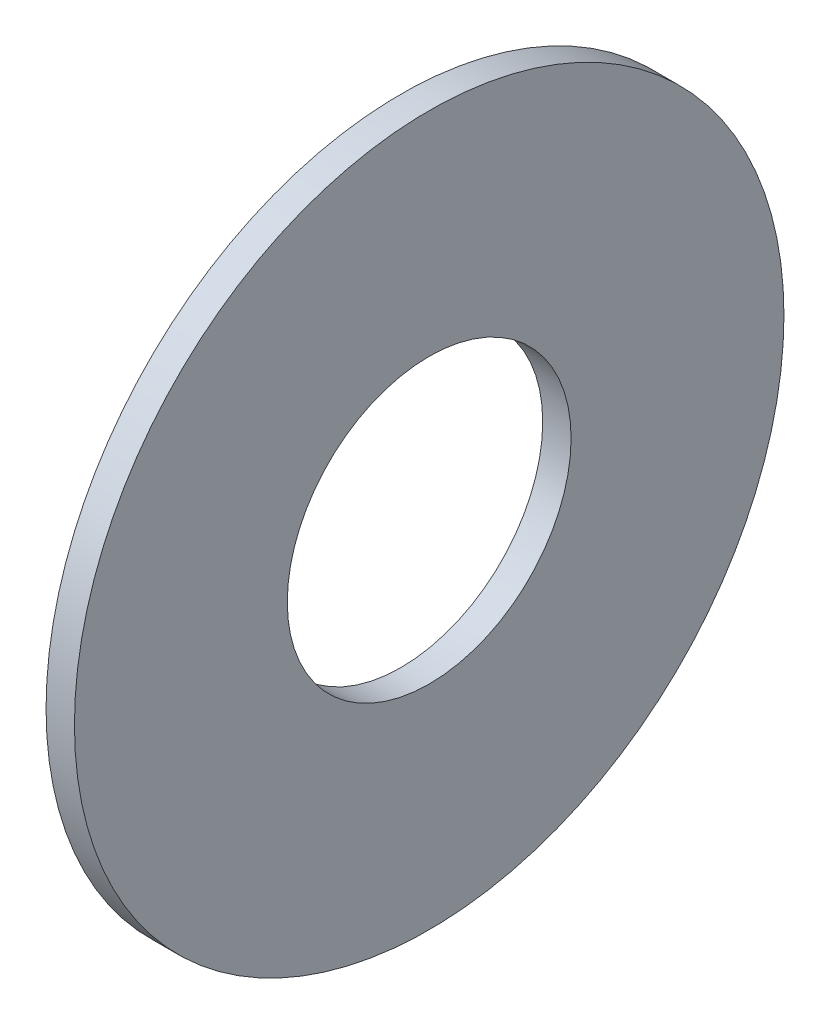
ISO-10303-21;
HEADER;
FILE_DESCRIPTION(('STEP AP214'),'2;1');
FILE_NAME('part.step','',(''),(''),'','','');
FILE_SCHEMA(('AUTOMOTIVE_DESIGN { 1 0 10303 214 1 1 1 1 }'));
ENDSEC;
DATA;
#1=APPLICATION_CONTEXT('core data for automotive mechanical design processes');
#2=APPLICATION_PROTOCOL_DEFINITION('international standard','automotive_design',2000,#1);
#3=PRODUCT_CONTEXT('',#1,'mechanical');
#4=PRODUCT('Part','Part','',(#3));
#5=PRODUCT_RELATED_PRODUCT_CATEGORY('part','',(#4));
#6=PRODUCT_DEFINITION_FORMATION('','',#4);
#7=PRODUCT_DEFINITION_CONTEXT('part definition',#1,'design');
#8=PRODUCT_DEFINITION('design','',#6,#7);
#9=PRODUCT_DEFINITION_SHAPE('','',#8);
#10=(LENGTH_UNIT() NAMED_UNIT(*) SI_UNIT(.MILLI.,.METRE.));
#11=(NAMED_UNIT(*) PLANE_ANGLE_UNIT() SI_UNIT($,.RADIAN.));
#12=(NAMED_UNIT(*) SI_UNIT($,.STERADIAN.) SOLID_ANGLE_UNIT());
#13=UNCERTAINTY_MEASURE_WITH_UNIT(LENGTH_MEASURE(1.E-05),#10,'distance_accuracy_value','');
#14=(GEOMETRIC_REPRESENTATION_CONTEXT(3) GLOBAL_UNCERTAINTY_ASSIGNED_CONTEXT((#13)) GLOBAL_UNIT_ASSIGNED_CONTEXT((#10,
#11,#12)) REPRESENTATION_CONTEXT('',''));
#15=CARTESIAN_POINT('',(0.,0.,0.));
#16=DIRECTION('',(0.,0.,1.));
#17=DIRECTION('',(1.,0.,0.));
#18=AXIS2_PLACEMENT_3D('',#15,#16,#17);
#19=CARTESIAN_POINT('',(0.,0.,0.));
#20=DIRECTION('',(1.,0.,0.));
#21=DIRECTION('',(0.,0.,-1.));
#22=AXIS2_PLACEMENT_3D('',#19,#20,#21);
#23=PLANE('',#22);
#24=CARTESIAN_POINT('',(0.,0.,0.));
#25=DIRECTION('',(1.,0.,0.));
#26=DIRECTION('',(0.,0.,-1.));
#27=AXIS2_PLACEMENT_3D('',#24,#25,#26);
#28=CIRCLE('',#27,5.);
#29=CARTESIAN_POINT('',(0.,0.,-5.));
#30=VERTEX_POINT('',#29);
#31=EDGE_CURVE('E29',#30,#30,#28,.T.);
#32=ORIENTED_EDGE('',*,*,#31,.T.);
#33=EDGE_LOOP('',(#32));
#34=FACE_BOUND('',#33,.T.);
#35=CARTESIAN_POINT('',(0.,0.,0.));
#36=DIRECTION('',(1.,0.,0.));
#37=DIRECTION('',(0.,0.,-1.));
#38=AXIS2_PLACEMENT_3D('',#35,#36,#37);
#39=CIRCLE('',#38,12.5);
#40=CARTESIAN_POINT('',(0.,0.,-12.5));
#41=VERTEX_POINT('',#40);
#42=EDGE_CURVE('E25',#41,#41,#39,.T.);
#43=ORIENTED_EDGE('',*,*,#42,.F.);
#44=EDGE_LOOP('',(#43));
#45=FACE_BOUND('',#44,.T.);
#46=ADVANCED_FACE('F14',(#34,#45),#23,.F.);
#47=CARTESIAN_POINT('',(1.,0.,0.));
#48=DIRECTION('',(1.,0.,0.));
#49=DIRECTION('',(0.,0.,-1.));
#50=AXIS2_PLACEMENT_3D('',#47,#48,#49);
#51=CYLINDRICAL_SURFACE('',#50,5.);
#52=CARTESIAN_POINT('',(1.,0.,0.));
#53=DIRECTION('',(1.,0.,0.));
#54=DIRECTION('',(0.,0.,-1.));
#55=AXIS2_PLACEMENT_3D('',#52,#53,#54);
#56=CIRCLE('',#55,5.);
#57=CARTESIAN_POINT('',(1.,0.,-5.));
#58=VERTEX_POINT('',#57);
#59=EDGE_CURVE('E21',#58,#58,#56,.T.);
#60=ORIENTED_EDGE('',*,*,#59,.T.);
#61=EDGE_LOOP('',(#60));
#62=FACE_BOUND('',#61,.T.);
#63=ORIENTED_EDGE('',*,*,#31,.F.);
#64=EDGE_LOOP('',(#63));
#65=FACE_BOUND('',#64,.T.);
#66=ADVANCED_FACE('F37',(#62,#65),#51,.F.);
#67=CARTESIAN_POINT('',(1.,0.,0.));
#68=DIRECTION('',(1.,0.,0.));
#69=DIRECTION('',(0.,0.,-1.));
#70=AXIS2_PLACEMENT_3D('',#67,#68,#69);
#71=CYLINDRICAL_SURFACE('',#70,12.5);
#72=CARTESIAN_POINT('',(1.,0.,0.));
#73=DIRECTION('',(1.,0.,0.));
#74=DIRECTION('',(0.,0.,-1.));
#75=AXIS2_PLACEMENT_3D('',#72,#73,#74);
#76=CIRCLE('',#75,12.5);
#77=CARTESIAN_POINT('',(1.,0.,-12.5));
#78=VERTEX_POINT('',#77);
#79=EDGE_CURVE('E10',#78,#78,#76,.T.);
#80=ORIENTED_EDGE('',*,*,#79,.F.);
#81=EDGE_LOOP('',(#80));
#82=FACE_BOUND('',#81,.T.);
#83=ORIENTED_EDGE('',*,*,#42,.T.);
#84=EDGE_LOOP('',(#83));
#85=FACE_BOUND('',#84,.T.);
#86=ADVANCED_FACE('F39',(#82,#85),#71,.T.);
#87=CARTESIAN_POINT('',(1.,12.5,0.));
#88=DIRECTION('',(-1.,0.,0.));
#89=DIRECTION('',(0.,0.,1.));
#90=AXIS2_PLACEMENT_3D('',#87,#88,#89);
#91=PLANE('',#90);
#92=ORIENTED_EDGE('',*,*,#59,.F.);
#93=EDGE_LOOP('',(#92));
#94=FACE_BOUND('',#93,.T.);
#95=ORIENTED_EDGE('',*,*,#79,.T.);
#96=EDGE_LOOP('',(#95));
#97=FACE_BOUND('',#96,.T.);
#98=ADVANCED_FACE('F16',(#94,#97),#91,.F.);
#99=CLOSED_SHELL('',(#46,#66,#86,#98));
#100=MANIFOLD_SOLID_BREP('B1',#99);
#101=ADVANCED_BREP_SHAPE_REPRESENTATION('',(#18,#100),#14);
#102=SHAPE_DEFINITION_REPRESENTATION(#9,#101);
ENDSEC;
END-ISO-10303-21;
